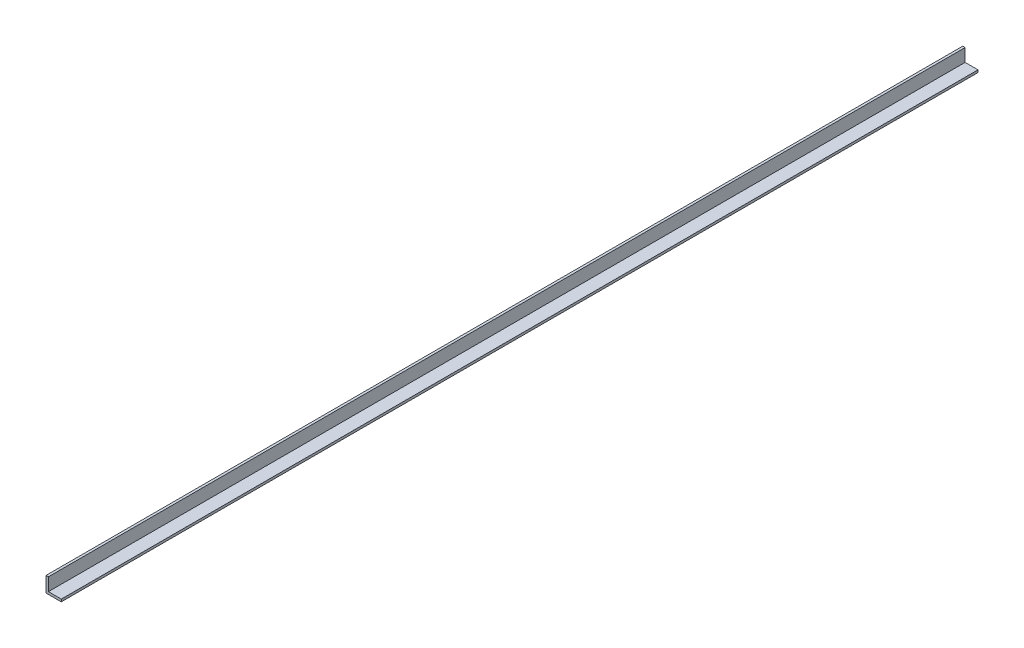
ISO-10303-21;
HEADER;
FILE_DESCRIPTION(('STEP AP214'),'2;1');
FILE_NAME('part.step','',(''),(''),'','','');
FILE_SCHEMA(('AUTOMOTIVE_DESIGN { 1 0 10303 214 1 1 1 1 }'));
ENDSEC;
DATA;
#1=APPLICATION_CONTEXT('core data for automotive mechanical design processes');
#2=APPLICATION_PROTOCOL_DEFINITION('international standard','automotive_design',2000,#1);
#3=PRODUCT_CONTEXT('',#1,'mechanical');
#4=PRODUCT('Part','Part','',(#3));
#5=PRODUCT_RELATED_PRODUCT_CATEGORY('part','',(#4));
#6=PRODUCT_DEFINITION_FORMATION('','',#4);
#7=PRODUCT_DEFINITION_CONTEXT('part definition',#1,'design');
#8=PRODUCT_DEFINITION('design','',#6,#7);
#9=PRODUCT_DEFINITION_SHAPE('','',#8);
#10=(LENGTH_UNIT() NAMED_UNIT(*) SI_UNIT(.MILLI.,.METRE.));
#11=(NAMED_UNIT(*) PLANE_ANGLE_UNIT() SI_UNIT($,.RADIAN.));
#12=(NAMED_UNIT(*) SI_UNIT($,.STERADIAN.) SOLID_ANGLE_UNIT());
#13=UNCERTAINTY_MEASURE_WITH_UNIT(LENGTH_MEASURE(1.E-05),#10,'distance_accuracy_value','');
#14=(GEOMETRIC_REPRESENTATION_CONTEXT(3) GLOBAL_UNCERTAINTY_ASSIGNED_CONTEXT((#13)) GLOBAL_UNIT_ASSIGNED_CONTEXT((#10,
#11,#12)) REPRESENTATION_CONTEXT('',''));
#15=CARTESIAN_POINT('',(0.,0.,0.));
#16=DIRECTION('',(0.,0.,1.));
#17=DIRECTION('',(1.,0.,0.));
#18=AXIS2_PLACEMENT_3D('',#15,#16,#17);
#19=CARTESIAN_POINT('',(15.88,101.6,-6100.));
#20=DIRECTION('',(0.,1.,0.));
#21=DIRECTION('',(0.,0.,1.));
#22=AXIS2_PLACEMENT_3D('',#19,#20,#21);
#23=PLANE('',#22);
#24=DIRECTION('',(-1.,0.,0.));
#25=VECTOR('',#24,1.);
#26=CARTESIAN_POINT('',(15.88,101.6,0.));
#27=LINE('',#26,#25);
#28=CARTESIAN_POINT('',(15.88,101.6,0.));
#29=VERTEX_POINT('',#28);
#30=CARTESIAN_POINT('',(0.,101.6,0.));
#31=VERTEX_POINT('',#30);
#32=EDGE_CURVE('E118',#29,#31,#27,.T.);
#33=ORIENTED_EDGE('',*,*,#32,.F.);
#34=DIRECTION('',(0.,0.,1.));
#35=VECTOR('',#34,1.);
#36=CARTESIAN_POINT('',(15.88,101.6,-6100.));
#37=LINE('',#36,#35);
#38=CARTESIAN_POINT('',(15.88,101.6,-6100.));
#39=VERTEX_POINT('',#38);
#40=EDGE_CURVE('E11',#39,#29,#37,.T.);
#41=ORIENTED_EDGE('',*,*,#40,.F.);
#42=DIRECTION('',(-1.,0.,0.));
#43=VECTOR('',#42,1.);
#44=CARTESIAN_POINT('',(15.88,101.6,-6100.));
#45=LINE('',#44,#43);
#46=CARTESIAN_POINT('',(0.,101.6,-6100.));
#47=VERTEX_POINT('',#46);
#48=EDGE_CURVE('E132',#39,#47,#45,.T.);
#49=ORIENTED_EDGE('',*,*,#48,.T.);
#50=DIRECTION('',(0.,0.,1.));
#51=VECTOR('',#50,1.);
#52=CARTESIAN_POINT('',(0.,101.6,-6100.));
#53=LINE('',#52,#51);
#54=EDGE_CURVE('E36',#47,#31,#53,.T.);
#55=ORIENTED_EDGE('',*,*,#54,.T.);
#56=EDGE_LOOP('',(#33,#41,#49,#55));
#57=FACE_BOUND('',#56,.T.);
#58=ADVANCED_FACE('F33',(#57),#23,.T.);
#59=CARTESIAN_POINT('',(15.88,15.88,-6100.));
#60=DIRECTION('',(1.,0.,0.));
#61=DIRECTION('',(0.,1.,0.));
#62=AXIS2_PLACEMENT_3D('',#59,#60,#61);
#63=PLANE('',#62);
#64=DIRECTION('',(0.,1.,0.));
#65=VECTOR('',#64,1.);
#66=CARTESIAN_POINT('',(15.88,15.88,0.));
#67=LINE('',#66,#65);
#68=CARTESIAN_POINT('',(15.88,15.88,0.));
#69=VERTEX_POINT('',#68);
#70=EDGE_CURVE('E130',#69,#29,#67,.T.);
#71=ORIENTED_EDGE('',*,*,#70,.F.);
#72=DIRECTION('',(0.,0.,1.));
#73=VECTOR('',#72,1.);
#74=CARTESIAN_POINT('',(15.88,15.88,-6100.));
#75=LINE('',#74,#73);
#76=CARTESIAN_POINT('',(15.88,15.88,-6100.));
#77=VERTEX_POINT('',#76);
#78=EDGE_CURVE('E42',#77,#69,#75,.T.);
#79=ORIENTED_EDGE('',*,*,#78,.F.);
#80=DIRECTION('',(0.,1.,0.));
#81=VECTOR('',#80,1.);
#82=CARTESIAN_POINT('',(15.88,15.88,-6100.));
#83=LINE('',#82,#81);
#84=EDGE_CURVE('E108',#77,#39,#83,.T.);
#85=ORIENTED_EDGE('',*,*,#84,.T.);
#86=ORIENTED_EDGE('',*,*,#40,.T.);
#87=EDGE_LOOP('',(#71,#79,#85,#86));
#88=FACE_BOUND('',#87,.T.);
#89=ADVANCED_FACE('F140',(#88),#63,.T.);
#90=CARTESIAN_POINT('',(101.6,15.88,-6100.));
#91=DIRECTION('',(0.,1.,0.));
#92=DIRECTION('',(-1.,0.,0.));
#93=AXIS2_PLACEMENT_3D('',#90,#91,#92);
#94=PLANE('',#93);
#95=DIRECTION('',(-1.,0.,0.));
#96=VECTOR('',#95,1.);
#97=CARTESIAN_POINT('',(101.6,15.88,0.));
#98=LINE('',#97,#96);
#99=CARTESIAN_POINT('',(101.6,15.88,0.));
#100=VERTEX_POINT('',#99);
#101=EDGE_CURVE('E95',#100,#69,#98,.T.);
#102=ORIENTED_EDGE('',*,*,#101,.F.);
#103=DIRECTION('',(0.,0.,1.));
#104=VECTOR('',#103,1.);
#105=CARTESIAN_POINT('',(101.6,15.88,-6100.));
#106=LINE('',#105,#104);
#107=CARTESIAN_POINT('',(101.6,15.88,-6100.));
#108=VERTEX_POINT('',#107);
#109=EDGE_CURVE('E90',#108,#100,#106,.T.);
#110=ORIENTED_EDGE('',*,*,#109,.F.);
#111=DIRECTION('',(-1.,0.,0.));
#112=VECTOR('',#111,1.);
#113=CARTESIAN_POINT('',(101.6,15.88,-6100.));
#114=LINE('',#113,#112);
#115=EDGE_CURVE('E93',#108,#77,#114,.T.);
#116=ORIENTED_EDGE('',*,*,#115,.T.);
#117=ORIENTED_EDGE('',*,*,#78,.T.);
#118=EDGE_LOOP('',(#102,#110,#116,#117));
#119=FACE_BOUND('',#118,.T.);
#120=ADVANCED_FACE('F92',(#119),#94,.T.);
#121=CARTESIAN_POINT('',(101.6,0.,-6100.));
#122=DIRECTION('',(1.,0.,0.));
#123=DIRECTION('',(0.,0.,-1.));
#124=AXIS2_PLACEMENT_3D('',#121,#122,#123);
#125=PLANE('',#124);
#126=DIRECTION('',(0.,1.,0.));
#127=VECTOR('',#126,1.);
#128=CARTESIAN_POINT('',(101.6,0.,0.));
#129=LINE('',#128,#127);
#130=CARTESIAN_POINT('',(101.6,0.,0.));
#131=VERTEX_POINT('',#130);
#132=EDGE_CURVE('E127',#131,#100,#129,.T.);
#133=ORIENTED_EDGE('',*,*,#132,.F.);
#134=DIRECTION('',(0.,0.,1.));
#135=VECTOR('',#134,1.);
#136=CARTESIAN_POINT('',(101.6,0.,-6100.));
#137=LINE('',#136,#135);
#138=CARTESIAN_POINT('',(101.6,0.,-6100.));
#139=VERTEX_POINT('',#138);
#140=EDGE_CURVE('E100',#139,#131,#137,.T.);
#141=ORIENTED_EDGE('',*,*,#140,.F.);
#142=DIRECTION('',(0.,1.,0.));
#143=VECTOR('',#142,1.);
#144=CARTESIAN_POINT('',(101.6,0.,-6100.));
#145=LINE('',#144,#143);
#146=EDGE_CURVE('E106',#139,#108,#145,.T.);
#147=ORIENTED_EDGE('',*,*,#146,.T.);
#148=ORIENTED_EDGE('',*,*,#109,.T.);
#149=EDGE_LOOP('',(#133,#141,#147,#148));
#150=FACE_BOUND('',#149,.T.);
#151=ADVANCED_FACE('F110',(#150),#125,.T.);
#152=CARTESIAN_POINT('',(0.,0.,-6100.));
#153=DIRECTION('',(0.,-1.,0.));
#154=DIRECTION('',(0.,0.,-1.));
#155=AXIS2_PLACEMENT_3D('',#152,#153,#154);
#156=PLANE('',#155);
#157=DIRECTION('',(1.,0.,0.));
#158=VECTOR('',#157,1.);
#159=CARTESIAN_POINT('',(0.,0.,0.));
#160=LINE('',#159,#158);
#161=CARTESIAN_POINT('',(0.,0.,0.));
#162=VERTEX_POINT('',#161);
#163=EDGE_CURVE('E124',#162,#131,#160,.T.);
#164=ORIENTED_EDGE('',*,*,#163,.F.);
#165=DIRECTION('',(0.,0.,1.));
#166=VECTOR('',#165,1.);
#167=CARTESIAN_POINT('',(0.,0.,-6100.));
#168=LINE('',#167,#166);
#169=CARTESIAN_POINT('',(0.,0.,-6100.));
#170=VERTEX_POINT('',#169);
#171=EDGE_CURVE('E135',#170,#162,#168,.T.);
#172=ORIENTED_EDGE('',*,*,#171,.F.);
#173=DIRECTION('',(1.,0.,0.));
#174=VECTOR('',#173,1.);
#175=CARTESIAN_POINT('',(0.,0.,-6100.));
#176=LINE('',#175,#174);
#177=EDGE_CURVE('E111',#170,#139,#176,.T.);
#178=ORIENTED_EDGE('',*,*,#177,.T.);
#179=ORIENTED_EDGE('',*,*,#140,.T.);
#180=EDGE_LOOP('',(#164,#172,#178,#179));
#181=FACE_BOUND('',#180,.T.);
#182=ADVANCED_FACE('F153',(#181),#156,.T.);
#183=CARTESIAN_POINT('',(0.,101.6,-6100.));
#184=DIRECTION('',(-1.,0.,0.));
#185=DIRECTION('',(0.,-1.,0.));
#186=AXIS2_PLACEMENT_3D('',#183,#184,#185);
#187=PLANE('',#186);
#188=DIRECTION('',(0.,-1.,0.));
#189=VECTOR('',#188,1.);
#190=CARTESIAN_POINT('',(0.,101.6,0.));
#191=LINE('',#190,#189);
#192=EDGE_CURVE('E121',#31,#162,#191,.T.);
#193=ORIENTED_EDGE('',*,*,#192,.F.);
#194=ORIENTED_EDGE('',*,*,#54,.F.);
#195=DIRECTION('',(0.,-1.,0.));
#196=VECTOR('',#195,1.);
#197=CARTESIAN_POINT('',(0.,101.6,-6100.));
#198=LINE('',#197,#196);
#199=EDGE_CURVE('E113',#47,#170,#198,.T.);
#200=ORIENTED_EDGE('',*,*,#199,.T.);
#201=ORIENTED_EDGE('',*,*,#171,.T.);
#202=EDGE_LOOP('',(#193,#194,#200,#201));
#203=FACE_BOUND('',#202,.T.);
#204=ADVANCED_FACE('F137',(#203),#187,.T.);
#205=CARTESIAN_POINT('',(0.,0.,-6100.));
#206=DIRECTION('',(0.,0.,1.));
#207=DIRECTION('',(1.,0.,0.));
#208=AXIS2_PLACEMENT_3D('',#205,#206,#207);
#209=PLANE('',#208);
#210=ORIENTED_EDGE('',*,*,#48,.F.);
#211=ORIENTED_EDGE('',*,*,#84,.F.);
#212=ORIENTED_EDGE('',*,*,#115,.F.);
#213=ORIENTED_EDGE('',*,*,#146,.F.);
#214=ORIENTED_EDGE('',*,*,#177,.F.);
#215=ORIENTED_EDGE('',*,*,#199,.F.);
#216=EDGE_LOOP('',(#210,#211,#212,#213,#214,#215));
#217=FACE_BOUND('',#216,.T.);
#218=ADVANCED_FACE('F104',(#217),#209,.F.);
#219=CARTESIAN_POINT('',(0.,0.,0.));
#220=DIRECTION('',(0.,0.,1.));
#221=DIRECTION('',(1.,0.,0.));
#222=AXIS2_PLACEMENT_3D('',#219,#220,#221);
#223=PLANE('',#222);
#224=ORIENTED_EDGE('',*,*,#32,.T.);
#225=ORIENTED_EDGE('',*,*,#192,.T.);
#226=ORIENTED_EDGE('',*,*,#163,.T.);
#227=ORIENTED_EDGE('',*,*,#132,.T.);
#228=ORIENTED_EDGE('',*,*,#101,.T.);
#229=ORIENTED_EDGE('',*,*,#70,.T.);
#230=EDGE_LOOP('',(#224,#225,#226,#227,#228,#229));
#231=FACE_BOUND('',#230,.T.);
#232=ADVANCED_FACE('F139',(#231),#223,.T.);
#233=CLOSED_SHELL('',(#58,#89,#120,#151,#182,#204,#218,#232));
#234=MANIFOLD_SOLID_BREP('B2',#233);
#235=ADVANCED_BREP_SHAPE_REPRESENTATION('',(#18,#234),#14);
#236=SHAPE_DEFINITION_REPRESENTATION(#9,#235);
ENDSEC;
END-ISO-10303-21;
